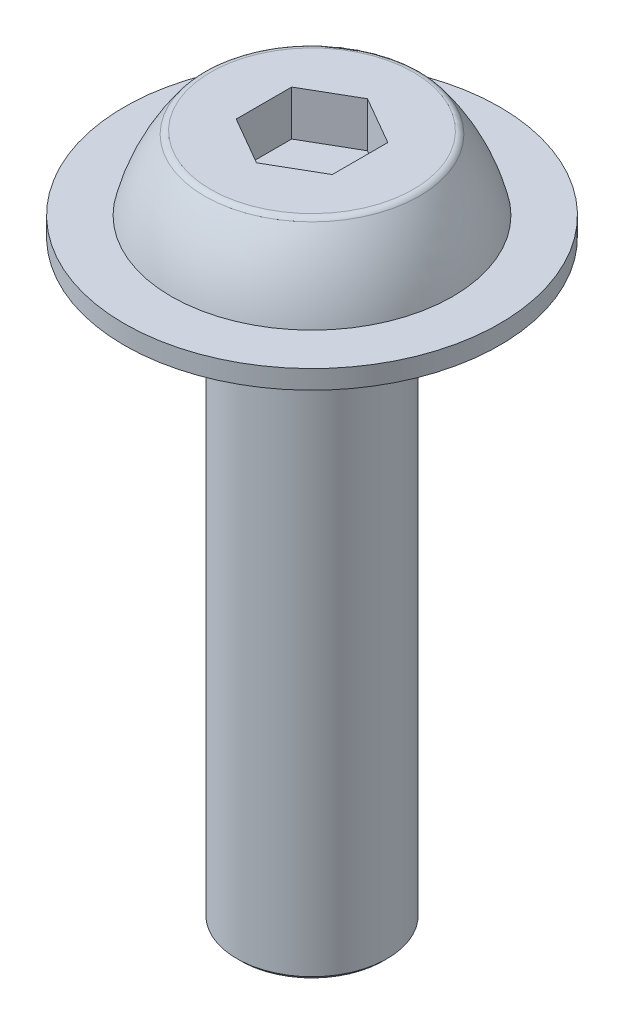
ISO-10303-21;
HEADER;
FILE_DESCRIPTION(('STEP AP214'),'2;1');
FILE_NAME('part.step','',(''),(''),'','','');
FILE_SCHEMA(('AUTOMOTIVE_DESIGN { 1 0 10303 214 1 1 1 1 }'));
ENDSEC;
DATA;
#1=APPLICATION_CONTEXT('core data for automotive mechanical design processes');
#2=APPLICATION_PROTOCOL_DEFINITION('international standard','automotive_design',2000,#1);
#3=PRODUCT_CONTEXT('',#1,'mechanical');
#4=PRODUCT('Part','Part','',(#3));
#5=PRODUCT_RELATED_PRODUCT_CATEGORY('part','',(#4));
#6=PRODUCT_DEFINITION_FORMATION('','',#4);
#7=PRODUCT_DEFINITION_CONTEXT('part definition',#1,'design');
#8=PRODUCT_DEFINITION('design','',#6,#7);
#9=PRODUCT_DEFINITION_SHAPE('','',#8);
#10=(LENGTH_UNIT() NAMED_UNIT(*) SI_UNIT(.MILLI.,.METRE.));
#11=(NAMED_UNIT(*) PLANE_ANGLE_UNIT() SI_UNIT($,.RADIAN.));
#12=(NAMED_UNIT(*) SI_UNIT($,.STERADIAN.) SOLID_ANGLE_UNIT());
#13=UNCERTAINTY_MEASURE_WITH_UNIT(LENGTH_MEASURE(1.E-05),#10,'distance_accuracy_value','');
#14=(GEOMETRIC_REPRESENTATION_CONTEXT(3) GLOBAL_UNCERTAINTY_ASSIGNED_CONTEXT((#13)) GLOBAL_UNIT_ASSIGNED_CONTEXT((#10,
#11,#12)) REPRESENTATION_CONTEXT('',''));
#15=CARTESIAN_POINT('',(0.,0.,0.));
#16=DIRECTION('',(0.,0.,1.));
#17=DIRECTION('',(1.,0.,0.));
#18=AXIS2_PLACEMENT_3D('',#15,#16,#17);
#19=CARTESIAN_POINT('',(0.,-0.90769069276326,0.));
#20=DIRECTION('',(0.,-1.,0.));
#21=DIRECTION('',(0.,0.,-1.));
#22=AXIS2_PLACEMENT_3D('',#19,#20,#21);
#23=DEGENERATE_TOROIDAL_SURFACE('',#22,1.11691952407917,5.,.F.);
#24=CARTESIAN_POINT('',(0.,2.12115377886514,0.));
#25=DIRECTION('',(0.,-1.,0.));
#26=DIRECTION('',(0.,0.,-1.));
#27=AXIS2_PLACEMENT_3D('',#24,#25,#26);
#28=CIRCLE('',#27,2.8612837345146);
#29=CARTESIAN_POINT('',(0.,2.12115377886514,-2.8612837345146));
#30=VERTEX_POINT('',#29);
#31=EDGE_CURVE('E120',#30,#30,#28,.T.);
#32=ORIENTED_EDGE('',*,*,#31,.T.);
#33=EDGE_LOOP('',(#32));
#34=FACE_BOUND('',#33,.T.);
#35=CARTESIAN_POINT('',(0.,0.25,0.));
#36=DIRECTION('',(0.,-1.,0.));
#37=DIRECTION('',(0.,0.,-1.));
#38=AXIS2_PLACEMENT_3D('',#35,#36,#37);
#39=CIRCLE('',#38,3.74720961276427);
#40=CARTESIAN_POINT('',(0.,0.25,-3.74720961276427));
#41=VERTEX_POINT('',#40);
#42=EDGE_CURVE('E11',#41,#41,#39,.T.);
#43=ORIENTED_EDGE('',*,*,#42,.F.);
#44=EDGE_LOOP('',(#43));
#45=FACE_BOUND('',#44,.T.);
#46=ADVANCED_FACE('F17',(#34,#45),#23,.F.);
#47=CARTESIAN_POINT('',(-2.8,2.2,0.));
#48=DIRECTION('',(0.,-1.,0.));
#49=DIRECTION('',(0.,0.,-1.));
#50=AXIS2_PLACEMENT_3D('',#47,#48,#49);
#51=PLANE('',#50);
#52=DIRECTION('',(-0.866025403784441,0.,0.5));
#53=VECTOR('',#52,1.);
#54=CARTESIAN_POINT('',(0.,2.2,-1.47801668912542));
#55=LINE('',#54,#53);
#56=CARTESIAN_POINT('',(0.,2.2,-1.47801668912542));
#57=VERTEX_POINT('',#56);
#58=CARTESIAN_POINT('',(-1.27999999999998,2.2,-0.739008344562711));
#59=VERTEX_POINT('',#58);
#60=EDGE_CURVE('E106',#57,#59,#55,.T.);
#61=ORIENTED_EDGE('',*,*,#60,.F.);
#62=DIRECTION('',(-0.866025403784441,0.,-0.5));
#63=VECTOR('',#62,1.);
#64=CARTESIAN_POINT('',(1.28,2.2,-0.739008344562722));
#65=LINE('',#64,#63);
#66=CARTESIAN_POINT('',(1.28,2.2,-0.739008344562722));
#67=VERTEX_POINT('',#66);
#68=EDGE_CURVE('E32',#67,#57,#65,.T.);
#69=ORIENTED_EDGE('',*,*,#68,.F.);
#70=DIRECTION('',(0.,0.,-1.));
#71=VECTOR('',#70,1.);
#72=CARTESIAN_POINT('',(1.28,2.2,0.739008344562721));
#73=LINE('',#72,#71);
#74=CARTESIAN_POINT('',(1.28,2.2,0.739008344562721));
#75=VERTEX_POINT('',#74);
#76=EDGE_CURVE('E116',#75,#67,#73,.T.);
#77=ORIENTED_EDGE('',*,*,#76,.F.);
#78=DIRECTION('',(0.866025403784439,0.,-0.5));
#79=VECTOR('',#78,1.);
#80=CARTESIAN_POINT('',(0.,2.2,1.47801668912544));
#81=LINE('',#80,#79);
#82=CARTESIAN_POINT('',(0.,2.2,1.47801668912544));
#83=VERTEX_POINT('',#82);
#84=EDGE_CURVE('E111',#83,#75,#81,.T.);
#85=ORIENTED_EDGE('',*,*,#84,.F.);
#86=DIRECTION('',(0.866025403784439,0.,0.5));
#87=VECTOR('',#86,1.);
#88=CARTESIAN_POINT('',(-1.28,2.2,0.739008344562721));
#89=LINE('',#88,#87);
#90=CARTESIAN_POINT('',(-1.28,2.2,0.739008344562721));
#91=VERTEX_POINT('',#90);
#92=EDGE_CURVE('E79',#91,#83,#89,.T.);
#93=ORIENTED_EDGE('',*,*,#92,.F.);
#94=DIRECTION('',(0.,0.,1.));
#95=VECTOR('',#94,1.);
#96=CARTESIAN_POINT('',(-1.27999999999998,2.2,-0.739008344562711));
#97=LINE('',#96,#95);
#98=EDGE_CURVE('E109',#59,#91,#97,.T.);
#99=ORIENTED_EDGE('',*,*,#98,.F.);
#100=EDGE_LOOP('',(#61,#69,#77,#85,#93,#99));
#101=FACE_BOUND('',#100,.T.);
#102=CARTESIAN_POINT('',(0.,2.2,0.));
#103=DIRECTION('',(0.,-1.,0.));
#104=DIRECTION('',(0.,0.,-1.));
#105=AXIS2_PLACEMENT_3D('',#102,#103,#104);
#106=CIRCLE('',#105,2.70215560417085);
#107=CARTESIAN_POINT('',(0.,2.2,-2.70215560417085));
#108=VERTEX_POINT('',#107);
#109=EDGE_CURVE('E128',#108,#108,#106,.F.);
#110=ORIENTED_EDGE('',*,*,#109,.T.);
#111=EDGE_LOOP('',(#110));
#112=FACE_BOUND('',#111,.T.);
#113=ADVANCED_FACE('F152',(#101,#112),#51,.F.);
#114=CARTESIAN_POINT('',(0.,2.,0.));
#115=DIRECTION('',(0.,-1.,0.));
#116=DIRECTION('',(0.,0.,-1.));
#117=AXIS2_PLACEMENT_3D('',#114,#115,#116);
#118=TOROIDAL_SURFACE('',#117,2.70215560417085,0.2);
#119=ORIENTED_EDGE('',*,*,#109,.F.);
#120=EDGE_LOOP('',(#119));
#121=FACE_BOUND('',#120,.T.);
#122=ORIENTED_EDGE('',*,*,#31,.F.);
#123=EDGE_LOOP('',(#122));
#124=FACE_BOUND('',#123,.T.);
#125=ADVANCED_FACE('F169',(#121,#124),#118,.T.);
#126=CARTESIAN_POINT('',(1.28,1.,-0.739008344562722));
#127=DIRECTION('',(0.5,0.,-0.866025403784441));
#128=DIRECTION('',(-0.866025403784441,0.,-0.5));
#129=AXIS2_PLACEMENT_3D('',#126,#127,#128);
#130=PLANE('',#129);
#131=ORIENTED_EDGE('',*,*,#68,.T.);
#132=DIRECTION('',(0.,1.,0.));
#133=VECTOR('',#132,1.);
#134=CARTESIAN_POINT('',(0.,1.,-1.47801668912542));
#135=LINE('',#134,#133);
#136=CARTESIAN_POINT('',(0.,1.,-1.47801668912542));
#137=VERTEX_POINT('',#136);
#138=EDGE_CURVE('E62',#137,#57,#135,.T.);
#139=ORIENTED_EDGE('',*,*,#138,.F.);
#140=DIRECTION('',(-0.866025403784441,0.,-0.5));
#141=VECTOR('',#140,1.);
#142=CARTESIAN_POINT('',(1.28,1.,-0.739008344562722));
#143=LINE('',#142,#141);
#144=CARTESIAN_POINT('',(1.28,1.,-0.739008344562722));
#145=VERTEX_POINT('',#144);
#146=EDGE_CURVE('E119',#145,#137,#143,.T.);
#147=ORIENTED_EDGE('',*,*,#146,.F.);
#148=DIRECTION('',(0.,1.,0.));
#149=VECTOR('',#148,1.);
#150=CARTESIAN_POINT('',(1.28,1.,-0.739008344562722));
#151=LINE('',#150,#149);
#152=EDGE_CURVE('E37',#145,#67,#151,.T.);
#153=ORIENTED_EDGE('',*,*,#152,.T.);
#154=EDGE_LOOP('',(#131,#139,#147,#153));
#155=FACE_BOUND('',#154,.T.);
#156=ADVANCED_FACE('F157',(#155),#130,.F.);
#157=CARTESIAN_POINT('',(1.28,1.,0.739008344562721));
#158=DIRECTION('',(1.,0.,0.));
#159=DIRECTION('',(0.,0.,-1.));
#160=AXIS2_PLACEMENT_3D('',#157,#158,#159);
#161=PLANE('',#160);
#162=ORIENTED_EDGE('',*,*,#76,.T.);
#163=ORIENTED_EDGE('',*,*,#152,.F.);
#164=DIRECTION('',(0.,0.,-1.));
#165=VECTOR('',#164,1.);
#166=CARTESIAN_POINT('',(1.28,1.,0.739008344562721));
#167=LINE('',#166,#165);
#168=CARTESIAN_POINT('',(1.28,1.,0.739008344562721));
#169=VERTEX_POINT('',#168);
#170=EDGE_CURVE('E95',#169,#145,#167,.T.);
#171=ORIENTED_EDGE('',*,*,#170,.F.);
#172=DIRECTION('',(0.,1.,0.));
#173=VECTOR('',#172,1.);
#174=CARTESIAN_POINT('',(1.28,1.,0.739008344562721));
#175=LINE('',#174,#173);
#176=EDGE_CURVE('E81',#169,#75,#175,.T.);
#177=ORIENTED_EDGE('',*,*,#176,.T.);
#178=EDGE_LOOP('',(#162,#163,#171,#177));
#179=FACE_BOUND('',#178,.T.);
#180=ADVANCED_FACE('F160',(#179),#161,.F.);
#181=CARTESIAN_POINT('',(0.,1.,1.47801668912544));
#182=DIRECTION('',(0.5,0.,0.866025403784439));
#183=DIRECTION('',(0.866025403784439,0.,-0.5));
#184=AXIS2_PLACEMENT_3D('',#181,#182,#183);
#185=PLANE('',#184);
#186=ORIENTED_EDGE('',*,*,#84,.T.);
#187=ORIENTED_EDGE('',*,*,#176,.F.);
#188=DIRECTION('',(0.866025403784439,0.,-0.5));
#189=VECTOR('',#188,1.);
#190=CARTESIAN_POINT('',(0.,1.,1.47801668912544));
#191=LINE('',#190,#189);
#192=CARTESIAN_POINT('',(0.,1.,1.47801668912544));
#193=VERTEX_POINT('',#192);
#194=EDGE_CURVE('E86',#193,#169,#191,.T.);
#195=ORIENTED_EDGE('',*,*,#194,.F.);
#196=DIRECTION('',(0.,1.,0.));
#197=VECTOR('',#196,1.);
#198=CARTESIAN_POINT('',(0.,1.,1.47801668912544));
#199=LINE('',#198,#197);
#200=EDGE_CURVE('E73',#193,#83,#199,.T.);
#201=ORIENTED_EDGE('',*,*,#200,.T.);
#202=EDGE_LOOP('',(#186,#187,#195,#201));
#203=FACE_BOUND('',#202,.T.);
#204=ADVANCED_FACE('F90',(#203),#185,.F.);
#205=CARTESIAN_POINT('',(-1.28,1.,0.739008344562721));
#206=DIRECTION('',(-0.5,0.,0.866025403784439));
#207=DIRECTION('',(0.866025403784439,0.,0.5));
#208=AXIS2_PLACEMENT_3D('',#205,#206,#207);
#209=PLANE('',#208);
#210=ORIENTED_EDGE('',*,*,#92,.T.);
#211=ORIENTED_EDGE('',*,*,#200,.F.);
#212=DIRECTION('',(0.866025403784439,0.,0.5));
#213=VECTOR('',#212,1.);
#214=CARTESIAN_POINT('',(-1.28,1.,0.739008344562721));
#215=LINE('',#214,#213);
#216=CARTESIAN_POINT('',(-1.28,1.,0.739008344562721));
#217=VERTEX_POINT('',#216);
#218=EDGE_CURVE('E80',#217,#193,#215,.T.);
#219=ORIENTED_EDGE('',*,*,#218,.F.);
#220=DIRECTION('',(0.,1.,0.));
#221=VECTOR('',#220,1.);
#222=CARTESIAN_POINT('',(-1.28,1.,0.739008344562721));
#223=LINE('',#222,#221);
#224=EDGE_CURVE('E83',#217,#91,#223,.T.);
#225=ORIENTED_EDGE('',*,*,#224,.T.);
#226=EDGE_LOOP('',(#210,#211,#219,#225));
#227=FACE_BOUND('',#226,.T.);
#228=ADVANCED_FACE('F74',(#227),#209,.F.);
#229=CARTESIAN_POINT('',(-1.27999999999998,1.,-0.739008344562711));
#230=DIRECTION('',(-1.,0.,0.));
#231=DIRECTION('',(0.,0.,1.));
#232=AXIS2_PLACEMENT_3D('',#229,#230,#231);
#233=PLANE('',#232);
#234=ORIENTED_EDGE('',*,*,#98,.T.);
#235=ORIENTED_EDGE('',*,*,#224,.F.);
#236=DIRECTION('',(0.,0.,1.));
#237=VECTOR('',#236,1.);
#238=CARTESIAN_POINT('',(-1.27999999999998,1.,-0.739008344562711));
#239=LINE('',#238,#237);
#240=CARTESIAN_POINT('',(-1.27999999999998,1.,-0.739008344562711));
#241=VERTEX_POINT('',#240);
#242=EDGE_CURVE('E98',#241,#217,#239,.T.);
#243=ORIENTED_EDGE('',*,*,#242,.F.);
#244=DIRECTION('',(0.,1.,0.));
#245=VECTOR('',#244,1.);
#246=CARTESIAN_POINT('',(-1.27999999999998,1.,-0.739008344562711));
#247=LINE('',#246,#245);
#248=EDGE_CURVE('E125',#241,#59,#247,.T.);
#249=ORIENTED_EDGE('',*,*,#248,.T.);
#250=EDGE_LOOP('',(#234,#235,#243,#249));
#251=FACE_BOUND('',#250,.T.);
#252=ADVANCED_FACE('F155',(#251),#233,.F.);
#253=CARTESIAN_POINT('',(0.,1.,-1.47801668912542));
#254=DIRECTION('',(-0.5,0.,-0.866025403784441));
#255=DIRECTION('',(-0.866025403784441,0.,0.5));
#256=AXIS2_PLACEMENT_3D('',#253,#254,#255);
#257=PLANE('',#256);
#258=ORIENTED_EDGE('',*,*,#60,.T.);
#259=ORIENTED_EDGE('',*,*,#248,.F.);
#260=DIRECTION('',(-0.866025403784441,0.,0.5));
#261=VECTOR('',#260,1.);
#262=CARTESIAN_POINT('',(0.,1.,-1.47801668912542));
#263=LINE('',#262,#261);
#264=EDGE_CURVE('E99',#137,#241,#263,.T.);
#265=ORIENTED_EDGE('',*,*,#264,.F.);
#266=ORIENTED_EDGE('',*,*,#138,.T.);
#267=EDGE_LOOP('',(#258,#259,#265,#266));
#268=FACE_BOUND('',#267,.T.);
#269=ADVANCED_FACE('F146',(#268),#257,.F.);
#270=CARTESIAN_POINT('',(0.,1.,0.));
#271=DIRECTION('',(0.,1.,0.));
#272=DIRECTION('',(0.,0.,1.));
#273=AXIS2_PLACEMENT_3D('',#270,#271,#272);
#274=PLANE('',#273);
#275=ORIENTED_EDGE('',*,*,#146,.T.);
#276=ORIENTED_EDGE('',*,*,#264,.T.);
#277=ORIENTED_EDGE('',*,*,#242,.T.);
#278=ORIENTED_EDGE('',*,*,#218,.T.);
#279=ORIENTED_EDGE('',*,*,#194,.T.);
#280=ORIENTED_EDGE('',*,*,#170,.T.);
#281=EDGE_LOOP('',(#275,#276,#277,#278,#279,#280));
#282=FACE_BOUND('',#281,.T.);
#283=ADVANCED_FACE('F92',(#282),#274,.T.);
#284=CARTESIAN_POINT('',(0.,-0.25,0.));
#285=DIRECTION('',(0.,1.,0.));
#286=DIRECTION('',(0.,0.,1.));
#287=AXIS2_PLACEMENT_3D('',#284,#285,#286);
#288=CYLINDRICAL_SURFACE('',#287,5.);
#289=CARTESIAN_POINT('',(0.,-0.25,0.));
#290=DIRECTION('',(0.,-1.,0.));
#291=DIRECTION('',(0.,0.,-1.));
#292=AXIS2_PLACEMENT_3D('',#289,#290,#291);
#293=CIRCLE('',#292,5.);
#294=CARTESIAN_POINT('',(0.,-0.25,-5.));
#295=VERTEX_POINT('',#294);
#296=EDGE_CURVE('E137',#295,#295,#293,.T.);
#297=ORIENTED_EDGE('',*,*,#296,.F.);
#298=EDGE_LOOP('',(#297));
#299=FACE_BOUND('',#298,.T.);
#300=CARTESIAN_POINT('',(0.,0.25,0.));
#301=DIRECTION('',(0.,-1.,0.));
#302=DIRECTION('',(0.,0.,-1.));
#303=AXIS2_PLACEMENT_3D('',#300,#301,#302);
#304=CIRCLE('',#303,5.);
#305=CARTESIAN_POINT('',(0.,0.25,-5.));
#306=VERTEX_POINT('',#305);
#307=EDGE_CURVE('E138',#306,#306,#304,.T.);
#308=ORIENTED_EDGE('',*,*,#307,.T.);
#309=EDGE_LOOP('',(#308));
#310=FACE_BOUND('',#309,.T.);
#311=ADVANCED_FACE('F234',(#299,#310),#288,.T.);
#312=CARTESIAN_POINT('',(0.,-0.25,0.));
#313=DIRECTION('',(0.,-1.,0.));
#314=DIRECTION('',(0.,0.,-1.));
#315=AXIS2_PLACEMENT_3D('',#312,#313,#314);
#316=PLANE('',#315);
#317=CARTESIAN_POINT('',(0.,-0.25,0.));
#318=DIRECTION('',(0.,-1.,0.));
#319=DIRECTION('',(0.,0.,-1.));
#320=AXIS2_PLACEMENT_3D('',#317,#318,#319);
#321=CIRCLE('',#320,2.);
#322=CARTESIAN_POINT('',(0.,-0.25,-2.));
#323=VERTEX_POINT('',#322);
#324=EDGE_CURVE('E110',#323,#323,#321,.T.);
#325=ORIENTED_EDGE('',*,*,#324,.F.);
#326=EDGE_LOOP('',(#325));
#327=FACE_BOUND('',#326,.T.);
#328=ORIENTED_EDGE('',*,*,#296,.T.);
#329=EDGE_LOOP('',(#328));
#330=FACE_BOUND('',#329,.T.);
#331=ADVANCED_FACE('F238',(#327,#330),#316,.T.);
#332=CARTESIAN_POINT('',(0.,0.25,0.));
#333=DIRECTION('',(0.,-1.,0.));
#334=DIRECTION('',(0.,0.,-1.));
#335=AXIS2_PLACEMENT_3D('',#332,#333,#334);
#336=PLANE('',#335);
#337=ORIENTED_EDGE('',*,*,#42,.T.);
#338=EDGE_LOOP('',(#337));
#339=FACE_BOUND('',#338,.T.);
#340=ORIENTED_EDGE('',*,*,#307,.F.);
#341=EDGE_LOOP('',(#340));
#342=FACE_BOUND('',#341,.T.);
#343=ADVANCED_FACE('F250',(#339,#342),#336,.F.);
#344=CARTESIAN_POINT('',(0.,-16.,0.));
#345=DIRECTION('',(0.,-1.,0.));
#346=DIRECTION('',(0.,0.,-1.));
#347=AXIS2_PLACEMENT_3D('',#344,#345,#346);
#348=PLANE('',#347);
#349=CARTESIAN_POINT('',(0.,-16.,0.));
#350=DIRECTION('',(0.,-1.,0.));
#351=DIRECTION('',(0.,0.,-1.));
#352=AXIS2_PLACEMENT_3D('',#349,#350,#351);
#353=CIRCLE('',#352,1.9);
#354=CARTESIAN_POINT('',(0.,-16.,-1.9));
#355=VERTEX_POINT('',#354);
#356=EDGE_CURVE('E131',#355,#355,#353,.T.);
#357=ORIENTED_EDGE('',*,*,#356,.T.);
#358=EDGE_LOOP('',(#357));
#359=FACE_BOUND('',#358,.T.);
#360=ADVANCED_FACE('F254',(#359),#348,.T.);
#361=CARTESIAN_POINT('',(0.,-16.,0.));
#362=DIRECTION('',(0.,1.,0.));
#363=DIRECTION('',(0.,0.,1.));
#364=AXIS2_PLACEMENT_3D('',#361,#362,#363);
#365=CONICAL_SURFACE('',#364,1.9,0.785398163397439);
#366=CARTESIAN_POINT('',(0.,-15.9,0.));
#367=DIRECTION('',(0.,-1.,0.));
#368=DIRECTION('',(0.,0.,-1.));
#369=AXIS2_PLACEMENT_3D('',#366,#367,#368);
#370=CIRCLE('',#369,2.);
#371=CARTESIAN_POINT('',(0.,-15.9,-2.));
#372=VERTEX_POINT('',#371);
#373=EDGE_CURVE('E25',#372,#372,#370,.F.);
#374=ORIENTED_EDGE('',*,*,#373,.F.);
#375=EDGE_LOOP('',(#374));
#376=FACE_BOUND('',#375,.T.);
#377=ORIENTED_EDGE('',*,*,#356,.F.);
#378=EDGE_LOOP('',(#377));
#379=FACE_BOUND('',#378,.T.);
#380=ADVANCED_FACE('F19',(#376,#379),#365,.T.);
#381=CARTESIAN_POINT('',(0.,-16.,0.));
#382=DIRECTION('',(0.,1.,0.));
#383=DIRECTION('',(0.,0.,1.));
#384=AXIS2_PLACEMENT_3D('',#381,#382,#383);
#385=CYLINDRICAL_SURFACE('',#384,2.);
#386=ORIENTED_EDGE('',*,*,#324,.T.);
#387=EDGE_LOOP('',(#386));
#388=FACE_BOUND('',#387,.T.);
#389=ORIENTED_EDGE('',*,*,#373,.T.);
#390=EDGE_LOOP('',(#389));
#391=FACE_BOUND('',#390,.T.);
#392=ADVANCED_FACE('F267',(#388,#391),#385,.T.);
#393=CLOSED_SHELL('',(#46,#113,#125,#156,#180,#204,#228,#252,#269,#283,#311,#331,#343,#360,#380,#392));
#394=MANIFOLD_SOLID_BREP('B1',#393);
#395=ADVANCED_BREP_SHAPE_REPRESENTATION('',(#18,#394),#14);
#396=SHAPE_DEFINITION_REPRESENTATION(#9,#395);
ENDSEC;
END-ISO-10303-21;
